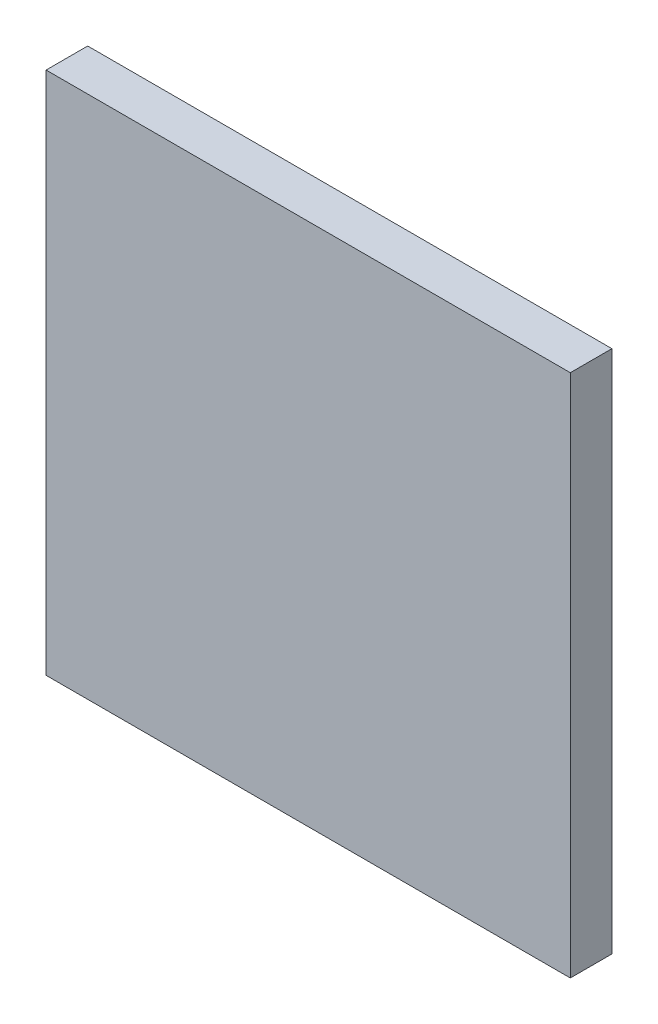
ISO-10303-21;
HEADER;
FILE_DESCRIPTION(('STEP AP214'),'2;1');
FILE_NAME('part.step','',(''),(''),'','','');
FILE_SCHEMA(('AUTOMOTIVE_DESIGN { 1 0 10303 214 1 1 1 1 }'));
ENDSEC;
DATA;
#1=APPLICATION_CONTEXT('core data for automotive mechanical design processes');
#2=APPLICATION_PROTOCOL_DEFINITION('international standard','automotive_design',2000,#1);
#3=PRODUCT_CONTEXT('',#1,'mechanical');
#4=PRODUCT('Part','Part','',(#3));
#5=PRODUCT_RELATED_PRODUCT_CATEGORY('part','',(#4));
#6=PRODUCT_DEFINITION_FORMATION('','',#4);
#7=PRODUCT_DEFINITION_CONTEXT('part definition',#1,'design');
#8=PRODUCT_DEFINITION('design','',#6,#7);
#9=PRODUCT_DEFINITION_SHAPE('','',#8);
#10=(LENGTH_UNIT() NAMED_UNIT(*) SI_UNIT(.MILLI.,.METRE.));
#11=(NAMED_UNIT(*) PLANE_ANGLE_UNIT() SI_UNIT($,.RADIAN.));
#12=(NAMED_UNIT(*) SI_UNIT($,.STERADIAN.) SOLID_ANGLE_UNIT());
#13=UNCERTAINTY_MEASURE_WITH_UNIT(LENGTH_MEASURE(1.E-05),#10,'distance_accuracy_value','');
#14=(GEOMETRIC_REPRESENTATION_CONTEXT(3) GLOBAL_UNCERTAINTY_ASSIGNED_CONTEXT((#13)) GLOBAL_UNIT_ASSIGNED_CONTEXT((#10,
#11,#12)) REPRESENTATION_CONTEXT('',''));
#15=CARTESIAN_POINT('',(0.,0.,0.));
#16=DIRECTION('',(0.,0.,1.));
#17=DIRECTION('',(1.,0.,0.));
#18=AXIS2_PLACEMENT_3D('',#15,#16,#17);
#19=CARTESIAN_POINT('',(-6.2992,-6.2992,1.));
#20=DIRECTION('',(1.,0.,0.));
#21=DIRECTION('',(0.,0.,-1.));
#22=AXIS2_PLACEMENT_3D('',#19,#20,#21);
#23=PLANE('',#22);
#24=DIRECTION('',(0.,-1.,0.));
#25=VECTOR('',#24,1.);
#26=CARTESIAN_POINT('',(-6.2992,-6.2992,0.));
#27=LINE('',#26,#25);
#28=CARTESIAN_POINT('',(-6.2992,6.2992,0.));
#29=VERTEX_POINT('',#28);
#30=CARTESIAN_POINT('',(-6.2992,-6.2992,0.));
#31=VERTEX_POINT('',#30);
#32=EDGE_CURVE('E95',#29,#31,#27,.T.);
#33=ORIENTED_EDGE('',*,*,#32,.T.);
#34=DIRECTION('',(0.,0.,-1.));
#35=VECTOR('',#34,1.);
#36=CARTESIAN_POINT('',(-6.2992,-6.2992,1.));
#37=LINE('',#36,#35);
#38=CARTESIAN_POINT('',(-6.2992,-6.2992,1.));
#39=VERTEX_POINT('',#38);
#40=EDGE_CURVE('E11',#39,#31,#37,.T.);
#41=ORIENTED_EDGE('',*,*,#40,.F.);
#42=DIRECTION('',(0.,-1.,0.));
#43=VECTOR('',#42,1.);
#44=CARTESIAN_POINT('',(-6.2992,-6.2992,1.));
#45=LINE('',#44,#43);
#46=CARTESIAN_POINT('',(-6.2992,6.2992,1.));
#47=VERTEX_POINT('',#46);
#48=EDGE_CURVE('E83',#47,#39,#45,.T.);
#49=ORIENTED_EDGE('',*,*,#48,.F.);
#50=DIRECTION('',(0.,0.,-1.));
#51=VECTOR('',#50,1.);
#52=CARTESIAN_POINT('',(-6.2992,6.2992,1.));
#53=LINE('',#52,#51);
#54=EDGE_CURVE('E91',#47,#29,#53,.T.);
#55=ORIENTED_EDGE('',*,*,#54,.T.);
#56=EDGE_LOOP('',(#33,#41,#49,#55));
#57=FACE_BOUND('',#56,.T.);
#58=ADVANCED_FACE('F32',(#57),#23,.F.);
#59=CARTESIAN_POINT('',(6.2992,-6.2992,1.));
#60=DIRECTION('',(0.,1.,0.));
#61=DIRECTION('',(0.,0.,1.));
#62=AXIS2_PLACEMENT_3D('',#59,#60,#61);
#63=PLANE('',#62);
#64=DIRECTION('',(1.,0.,0.));
#65=VECTOR('',#64,1.);
#66=CARTESIAN_POINT('',(6.2992,-6.2992,0.));
#67=LINE('',#66,#65);
#68=CARTESIAN_POINT('',(6.2992,-6.2992,0.));
#69=VERTEX_POINT('',#68);
#70=EDGE_CURVE('E87',#31,#69,#67,.T.);
#71=ORIENTED_EDGE('',*,*,#70,.T.);
#72=DIRECTION('',(0.,0.,-1.));
#73=VECTOR('',#72,1.);
#74=CARTESIAN_POINT('',(6.2992,-6.2992,1.));
#75=LINE('',#74,#73);
#76=CARTESIAN_POINT('',(6.2992,-6.2992,1.));
#77=VERTEX_POINT('',#76);
#78=EDGE_CURVE('E40',#77,#69,#75,.T.);
#79=ORIENTED_EDGE('',*,*,#78,.F.);
#80=DIRECTION('',(1.,0.,0.));
#81=VECTOR('',#80,1.);
#82=CARTESIAN_POINT('',(6.2992,-6.2992,1.));
#83=LINE('',#82,#81);
#84=EDGE_CURVE('E78',#39,#77,#83,.T.);
#85=ORIENTED_EDGE('',*,*,#84,.F.);
#86=ORIENTED_EDGE('',*,*,#40,.T.);
#87=EDGE_LOOP('',(#71,#79,#85,#86));
#88=FACE_BOUND('',#87,.T.);
#89=ADVANCED_FACE('F86',(#88),#63,.F.);
#90=CARTESIAN_POINT('',(6.2992,6.2992,1.));
#91=DIRECTION('',(-1.,0.,0.));
#92=DIRECTION('',(0.,0.,1.));
#93=AXIS2_PLACEMENT_3D('',#90,#91,#92);
#94=PLANE('',#93);
#95=DIRECTION('',(0.,1.,0.));
#96=VECTOR('',#95,1.);
#97=CARTESIAN_POINT('',(6.2992,6.2992,0.));
#98=LINE('',#97,#96);
#99=CARTESIAN_POINT('',(6.2992,6.2992,0.));
#100=VERTEX_POINT('',#99);
#101=EDGE_CURVE('E65',#69,#100,#98,.T.);
#102=ORIENTED_EDGE('',*,*,#101,.T.);
#103=DIRECTION('',(0.,0.,-1.));
#104=VECTOR('',#103,1.);
#105=CARTESIAN_POINT('',(6.2992,6.2992,1.));
#106=LINE('',#105,#104);
#107=CARTESIAN_POINT('',(6.2992,6.2992,1.));
#108=VERTEX_POINT('',#107);
#109=EDGE_CURVE('E88',#108,#100,#106,.T.);
#110=ORIENTED_EDGE('',*,*,#109,.F.);
#111=DIRECTION('',(0.,1.,0.));
#112=VECTOR('',#111,1.);
#113=CARTESIAN_POINT('',(6.2992,6.2992,1.));
#114=LINE('',#113,#112);
#115=EDGE_CURVE('E81',#77,#108,#114,.T.);
#116=ORIENTED_EDGE('',*,*,#115,.F.);
#117=ORIENTED_EDGE('',*,*,#78,.T.);
#118=EDGE_LOOP('',(#102,#110,#116,#117));
#119=FACE_BOUND('',#118,.T.);
#120=ADVANCED_FACE('F89',(#119),#94,.F.);
#121=CARTESIAN_POINT('',(-6.2992,6.2992,1.));
#122=DIRECTION('',(0.,-1.,0.));
#123=DIRECTION('',(0.,0.,-1.));
#124=AXIS2_PLACEMENT_3D('',#121,#122,#123);
#125=PLANE('',#124);
#126=DIRECTION('',(-1.,0.,0.));
#127=VECTOR('',#126,1.);
#128=CARTESIAN_POINT('',(-6.2992,6.2992,0.));
#129=LINE('',#128,#127);
#130=EDGE_CURVE('E71',#100,#29,#129,.T.);
#131=ORIENTED_EDGE('',*,*,#130,.T.);
#132=ORIENTED_EDGE('',*,*,#54,.F.);
#133=DIRECTION('',(-1.,0.,0.));
#134=VECTOR('',#133,1.);
#135=CARTESIAN_POINT('',(-6.2992,6.2992,1.));
#136=LINE('',#135,#134);
#137=EDGE_CURVE('E48',#108,#47,#136,.T.);
#138=ORIENTED_EDGE('',*,*,#137,.F.);
#139=ORIENTED_EDGE('',*,*,#109,.T.);
#140=EDGE_LOOP('',(#131,#132,#138,#139));
#141=FACE_BOUND('',#140,.T.);
#142=ADVANCED_FACE('F102',(#141),#125,.F.);
#143=CARTESIAN_POINT('',(0.,0.,1.));
#144=DIRECTION('',(0.,0.,-1.));
#145=DIRECTION('',(-1.,0.,0.));
#146=AXIS2_PLACEMENT_3D('',#143,#144,#145);
#147=PLANE('',#146);
#148=ORIENTED_EDGE('',*,*,#48,.T.);
#149=ORIENTED_EDGE('',*,*,#84,.T.);
#150=ORIENTED_EDGE('',*,*,#115,.T.);
#151=ORIENTED_EDGE('',*,*,#137,.T.);
#152=EDGE_LOOP('',(#148,#149,#150,#151));
#153=FACE_BOUND('',#152,.T.);
#154=ADVANCED_FACE('F79',(#153),#147,.F.);
#155=CARTESIAN_POINT('',(0.,0.,0.));
#156=DIRECTION('',(0.,0.,-1.));
#157=DIRECTION('',(-1.,0.,0.));
#158=AXIS2_PLACEMENT_3D('',#155,#156,#157);
#159=PLANE('',#158);
#160=ORIENTED_EDGE('',*,*,#32,.F.);
#161=ORIENTED_EDGE('',*,*,#130,.F.);
#162=ORIENTED_EDGE('',*,*,#101,.F.);
#163=ORIENTED_EDGE('',*,*,#70,.F.);
#164=EDGE_LOOP('',(#160,#161,#162,#163));
#165=FACE_BOUND('',#164,.T.);
#166=ADVANCED_FACE('F105',(#165),#159,.T.);
#167=CLOSED_SHELL('',(#58,#89,#120,#142,#154,#166));
#168=MANIFOLD_SOLID_BREP('B2',#167);
#169=ADVANCED_BREP_SHAPE_REPRESENTATION('',(#18,#168),#14);
#170=SHAPE_DEFINITION_REPRESENTATION(#9,#169);
ENDSEC;
END-ISO-10303-21;
